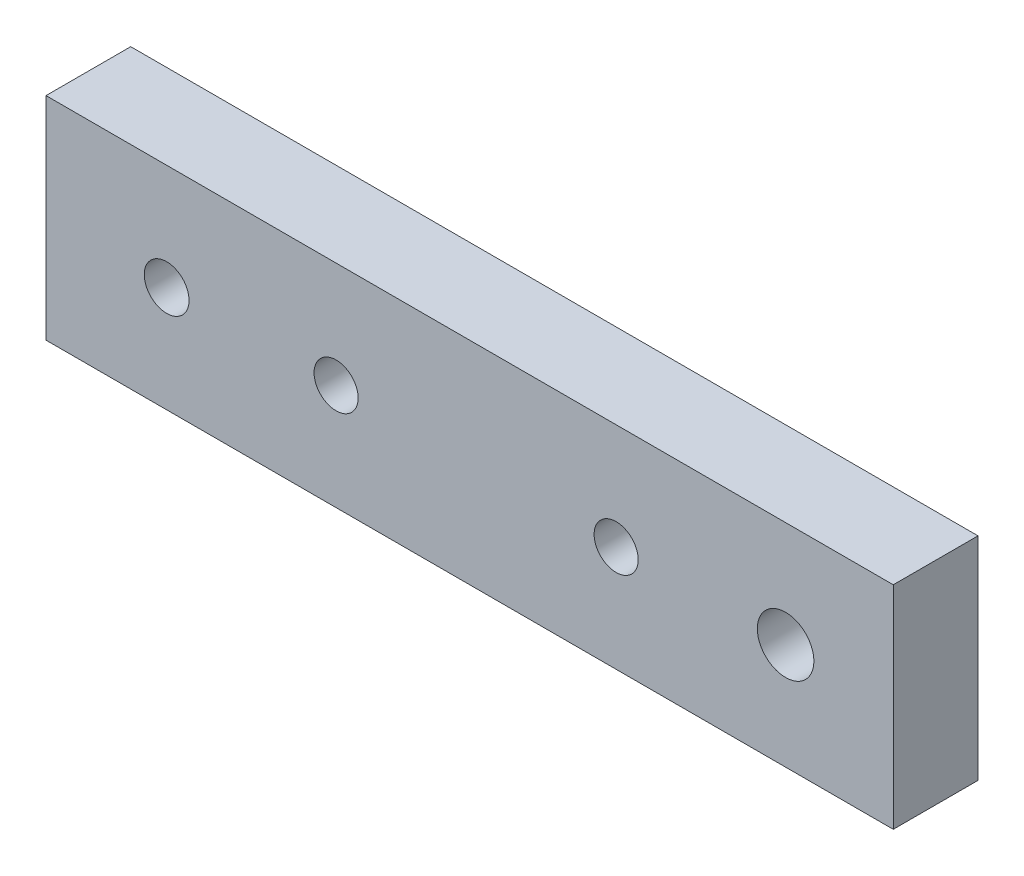
ISO-10303-21;
HEADER;
FILE_DESCRIPTION(('STEP AP214'),'2;1');
FILE_NAME('part.step','',(''),(''),'','','');
FILE_SCHEMA(('AUTOMOTIVE_DESIGN { 1 0 10303 214 1 1 1 1 }'));
ENDSEC;
DATA;
#1=APPLICATION_CONTEXT('core data for automotive mechanical design processes');
#2=APPLICATION_PROTOCOL_DEFINITION('international standard','automotive_design',2000,#1);
#3=PRODUCT_CONTEXT('',#1,'mechanical');
#4=PRODUCT('Part','Part','',(#3));
#5=PRODUCT_RELATED_PRODUCT_CATEGORY('part','',(#4));
#6=PRODUCT_DEFINITION_FORMATION('','',#4);
#7=PRODUCT_DEFINITION_CONTEXT('part definition',#1,'design');
#8=PRODUCT_DEFINITION('design','',#6,#7);
#9=PRODUCT_DEFINITION_SHAPE('','',#8);
#10=(LENGTH_UNIT() NAMED_UNIT(*) SI_UNIT(.MILLI.,.METRE.));
#11=(NAMED_UNIT(*) PLANE_ANGLE_UNIT() SI_UNIT($,.RADIAN.));
#12=(NAMED_UNIT(*) SI_UNIT($,.STERADIAN.) SOLID_ANGLE_UNIT());
#13=UNCERTAINTY_MEASURE_WITH_UNIT(LENGTH_MEASURE(1.E-05),#10,'distance_accuracy_value','');
#14=(GEOMETRIC_REPRESENTATION_CONTEXT(3) GLOBAL_UNCERTAINTY_ASSIGNED_CONTEXT((#13)) GLOBAL_UNIT_ASSIGNED_CONTEXT((#10,
#11,#12)) REPRESENTATION_CONTEXT('',''));
#15=CARTESIAN_POINT('',(0.,0.,0.));
#16=DIRECTION('',(0.,0.,1.));
#17=DIRECTION('',(1.,0.,0.));
#18=AXIS2_PLACEMENT_3D('',#15,#16,#17);
#19=CARTESIAN_POINT('',(116.291637204089,12.5,-75.));
#20=DIRECTION('',(0.,0.,1.));
#21=DIRECTION('',(1.,0.,0.));
#22=AXIS2_PLACEMENT_3D('',#19,#20,#21);
#23=CYLINDRICAL_SURFACE('',#22,3.33518087500682);
#24=CARTESIAN_POINT('',(116.291637204089,12.5,-17.5000000000001));
#25=DIRECTION('',(0.,0.,-1.));
#26=DIRECTION('',(-1.,0.,0.));
#27=AXIS2_PLACEMENT_3D('',#24,#25,#26);
#28=CIRCLE('',#27,3.33518087500682);
#29=CARTESIAN_POINT('',(112.956456329082,12.5,-17.5000000000001));
#30=VERTEX_POINT('',#29);
#31=EDGE_CURVE('E444',#30,#30,#28,.T.);
#32=ORIENTED_EDGE('',*,*,#31,.F.);
#33=EDGE_LOOP('',(#32));
#34=FACE_BOUND('',#33,.T.);
#35=CARTESIAN_POINT('',(116.291637204089,12.5,-24.5000000000001));
#36=DIRECTION('',(0.,0.,-1.));
#37=DIRECTION('',(0.,1.,0.));
#38=AXIS2_PLACEMENT_3D('',#35,#36,#37);
#39=CIRCLE('',#38,3.33518087500682);
#40=CARTESIAN_POINT('',(116.291637204089,15.8351808750068,-24.5000000000001));
#41=VERTEX_POINT('',#40);
#42=EDGE_CURVE('E36',#41,#41,#39,.F.);
#43=ORIENTED_EDGE('',*,*,#42,.F.);
#44=EDGE_LOOP('',(#43));
#45=FACE_BOUND('',#44,.T.);
#46=ADVANCED_FACE('F32',(#34,#45),#23,.F.);
#47=CARTESIAN_POINT('',(43.2405642550662,12.5,-75.));
#48=DIRECTION('',(0.,0.,1.));
#49=DIRECTION('',(1.,0.,0.));
#50=AXIS2_PLACEMENT_3D('',#47,#48,#49);
#51=CYLINDRICAL_SURFACE('',#50,2.64345653870219);
#52=CARTESIAN_POINT('',(43.2405642550662,12.5,-17.5000000000001));
#53=DIRECTION('',(0.,0.,-1.));
#54=DIRECTION('',(-1.,0.,0.));
#55=AXIS2_PLACEMENT_3D('',#52,#53,#54);
#56=CIRCLE('',#55,2.64345653870219);
#57=CARTESIAN_POINT('',(40.597107716364,12.5,-17.5000000000001));
#58=VERTEX_POINT('',#57);
#59=EDGE_CURVE('E447',#58,#58,#56,.T.);
#60=ORIENTED_EDGE('',*,*,#59,.F.);
#61=EDGE_LOOP('',(#60));
#62=FACE_BOUND('',#61,.T.);
#63=CARTESIAN_POINT('',(43.2405642550662,12.5,-24.5000000000001));
#64=DIRECTION('',(0.,0.,-1.));
#65=DIRECTION('',(-1.,0.,0.));
#66=AXIS2_PLACEMENT_3D('',#63,#64,#65);
#67=CIRCLE('',#66,2.64345653870219);
#68=CARTESIAN_POINT('',(40.597107716364,12.5,-24.5000000000001));
#69=VERTEX_POINT('',#68);
#70=EDGE_CURVE('E459',#69,#69,#67,.F.);
#71=ORIENTED_EDGE('',*,*,#70,.F.);
#72=EDGE_LOOP('',(#71));
#73=FACE_BOUND('',#72,.T.);
#74=ADVANCED_FACE('F469',(#62,#73),#51,.F.);
#75=CARTESIAN_POINT('',(96.2916372040886,12.5,-75.));
#76=DIRECTION('',(0.,0.,1.));
#77=DIRECTION('',(1.,0.,0.));
#78=AXIS2_PLACEMENT_3D('',#75,#76,#77);
#79=CYLINDRICAL_SURFACE('',#78,2.6);
#80=CARTESIAN_POINT('',(96.2916372040886,12.5,-17.5000000000001));
#81=DIRECTION('',(0.,0.,-1.));
#82=DIRECTION('',(-1.,0.,0.));
#83=AXIS2_PLACEMENT_3D('',#80,#81,#82);
#84=CIRCLE('',#83,2.6);
#85=CARTESIAN_POINT('',(93.6916372040886,12.5,-17.5000000000001));
#86=VERTEX_POINT('',#85);
#87=EDGE_CURVE('E450',#86,#86,#84,.T.);
#88=ORIENTED_EDGE('',*,*,#87,.F.);
#89=EDGE_LOOP('',(#88));
#90=FACE_BOUND('',#89,.T.);
#91=CARTESIAN_POINT('',(96.2916372040886,12.5,-24.5000000000001));
#92=DIRECTION('',(0.,0.,-1.));
#93=DIRECTION('',(-1.,0.,0.));
#94=AXIS2_PLACEMENT_3D('',#91,#92,#93);
#95=CIRCLE('',#94,2.6);
#96=CARTESIAN_POINT('',(93.6916372040886,12.5,-24.5000000000001));
#97=VERTEX_POINT('',#96);
#98=EDGE_CURVE('E457',#97,#97,#95,.F.);
#99=ORIENTED_EDGE('',*,*,#98,.F.);
#100=EDGE_LOOP('',(#99));
#101=FACE_BOUND('',#100,.T.);
#102=ADVANCED_FACE('F475',(#90,#101),#79,.F.);
#103=CARTESIAN_POINT('',(63.2405642550662,12.5,-75.));
#104=DIRECTION('',(0.,0.,1.));
#105=DIRECTION('',(1.,0.,0.));
#106=AXIS2_PLACEMENT_3D('',#103,#104,#105);
#107=CYLINDRICAL_SURFACE('',#106,2.6);
#108=CARTESIAN_POINT('',(63.2405642550662,12.5,-17.5000000000001));
#109=DIRECTION('',(0.,0.,-1.));
#110=DIRECTION('',(-1.,0.,0.));
#111=AXIS2_PLACEMENT_3D('',#108,#109,#110);
#112=CIRCLE('',#111,2.6);
#113=CARTESIAN_POINT('',(60.6405642550662,12.5,-17.5000000000001));
#114=VERTEX_POINT('',#113);
#115=EDGE_CURVE('E432',#114,#114,#112,.T.);
#116=ORIENTED_EDGE('',*,*,#115,.F.);
#117=EDGE_LOOP('',(#116));
#118=FACE_BOUND('',#117,.T.);
#119=CARTESIAN_POINT('',(63.2405642550662,12.5,-24.5000000000001));
#120=DIRECTION('',(0.,0.,-1.));
#121=DIRECTION('',(-1.,0.,0.));
#122=AXIS2_PLACEMENT_3D('',#119,#120,#121);
#123=CIRCLE('',#122,2.6);
#124=CARTESIAN_POINT('',(60.6405642550662,12.5,-24.5000000000001));
#125=VERTEX_POINT('',#124);
#126=EDGE_CURVE('E268',#125,#125,#123,.F.);
#127=ORIENTED_EDGE('',*,*,#126,.F.);
#128=EDGE_LOOP('',(#127));
#129=FACE_BOUND('',#128,.T.);
#130=ADVANCED_FACE('F502',(#118,#129),#107,.F.);
#131=CARTESIAN_POINT('',(29.0000000000001,25.,-27.5000000000001));
#132=DIRECTION('',(1.,0.,0.));
#133=DIRECTION('',(0.,0.,-1.));
#134=AXIS2_PLACEMENT_3D('',#131,#132,#133);
#135=PLANE('',#134);
#136=DIRECTION('',(0.,1.,0.));
#137=VECTOR('',#136,1.);
#138=CARTESIAN_POINT('',(29.0000000000001,25.,-17.5000000000001));
#139=LINE('',#138,#137);
#140=CARTESIAN_POINT('',(29.0000000000001,0.,-17.5000000000001));
#141=VERTEX_POINT('',#140);
#142=CARTESIAN_POINT('',(29.0000000000001,25.,-17.5000000000001));
#143=VERTEX_POINT('',#142);
#144=EDGE_CURVE('E428',#141,#143,#139,.T.);
#145=ORIENTED_EDGE('',*,*,#144,.T.);
#146=DIRECTION('',(0.,0.,1.));
#147=VECTOR('',#146,1.);
#148=CARTESIAN_POINT('',(29.0000000000001,25.,-27.5000000000001));
#149=LINE('',#148,#147);
#150=CARTESIAN_POINT('',(29.0000000000001,25.,-27.5000000000001));
#151=VERTEX_POINT('',#150);
#152=EDGE_CURVE('E11',#151,#143,#149,.T.);
#153=ORIENTED_EDGE('',*,*,#152,.F.);
#154=DIRECTION('',(0.,1.,0.));
#155=VECTOR('',#154,1.);
#156=CARTESIAN_POINT('',(29.0000000000001,25.,-27.5000000000001));
#157=LINE('',#156,#155);
#158=CARTESIAN_POINT('',(29.0000000000001,0.,-27.5000000000001));
#159=VERTEX_POINT('',#158);
#160=EDGE_CURVE('E417',#159,#151,#157,.T.);
#161=ORIENTED_EDGE('',*,*,#160,.F.);
#162=DIRECTION('',(0.,0.,1.));
#163=VECTOR('',#162,1.);
#164=CARTESIAN_POINT('',(29.0000000000001,0.,-27.5000000000001));
#165=LINE('',#164,#163);
#166=EDGE_CURVE('E427',#159,#141,#165,.T.);
#167=ORIENTED_EDGE('',*,*,#166,.T.);
#168=EDGE_LOOP('',(#145,#153,#161,#167));
#169=FACE_BOUND('',#168,.T.);
#170=ADVANCED_FACE('F34',(#169),#135,.F.);
#171=CARTESIAN_POINT('',(129.,25.,-27.5000000000001));
#172=DIRECTION('',(0.,-1.,0.));
#173=DIRECTION('',(0.,0.,-1.));
#174=AXIS2_PLACEMENT_3D('',#171,#172,#173);
#175=PLANE('',#174);
#176=DIRECTION('',(1.,0.,0.));
#177=VECTOR('',#176,1.);
#178=CARTESIAN_POINT('',(129.,25.,-17.5000000000001));
#179=LINE('',#178,#177);
#180=CARTESIAN_POINT('',(129.,25.,-17.5000000000001));
#181=VERTEX_POINT('',#180);
#182=EDGE_CURVE('E431',#143,#181,#179,.T.);
#183=ORIENTED_EDGE('',*,*,#182,.T.);
#184=DIRECTION('',(0.,0.,1.));
#185=VECTOR('',#184,1.);
#186=CARTESIAN_POINT('',(129.,25.,-27.5000000000001));
#187=LINE('',#186,#185);
#188=CARTESIAN_POINT('',(129.,25.,-27.5000000000001));
#189=VERTEX_POINT('',#188);
#190=EDGE_CURVE('E41',#189,#181,#187,.T.);
#191=ORIENTED_EDGE('',*,*,#190,.F.);
#192=DIRECTION('',(1.,0.,0.));
#193=VECTOR('',#192,1.);
#194=CARTESIAN_POINT('',(129.,25.,-27.5000000000001));
#195=LINE('',#194,#193);
#196=EDGE_CURVE('E420',#151,#189,#195,.T.);
#197=ORIENTED_EDGE('',*,*,#196,.F.);
#198=ORIENTED_EDGE('',*,*,#152,.T.);
#199=EDGE_LOOP('',(#183,#191,#197,#198));
#200=FACE_BOUND('',#199,.T.);
#201=ADVANCED_FACE('F495',(#200),#175,.F.);
#202=CARTESIAN_POINT('',(129.,25.,-27.5000000000001));
#203=DIRECTION('',(-1.,0.,0.));
#204=DIRECTION('',(0.,-1.,0.));
#205=AXIS2_PLACEMENT_3D('',#202,#203,#204);
#206=PLANE('',#205);
#207=DIRECTION('',(0.,-1.,0.));
#208=VECTOR('',#207,1.);
#209=CARTESIAN_POINT('',(129.,25.,-17.5000000000001));
#210=LINE('',#209,#208);
#211=CARTESIAN_POINT('',(129.,0.,-17.5000000000001));
#212=VERTEX_POINT('',#211);
#213=EDGE_CURVE('E434',#181,#212,#210,.T.);
#214=ORIENTED_EDGE('',*,*,#213,.T.);
#215=DIRECTION('',(0.,0.,1.));
#216=VECTOR('',#215,1.);
#217=CARTESIAN_POINT('',(129.,0.,-27.5000000000001));
#218=LINE('',#217,#216);
#219=CARTESIAN_POINT('',(129.,0.,-27.5000000000001));
#220=VERTEX_POINT('',#219);
#221=EDGE_CURVE('E439',#220,#212,#218,.T.);
#222=ORIENTED_EDGE('',*,*,#221,.F.);
#223=DIRECTION('',(0.,-1.,0.));
#224=VECTOR('',#223,1.);
#225=CARTESIAN_POINT('',(129.,25.,-27.5000000000001));
#226=LINE('',#225,#224);
#227=EDGE_CURVE('E423',#189,#220,#226,.T.);
#228=ORIENTED_EDGE('',*,*,#227,.F.);
#229=ORIENTED_EDGE('',*,*,#190,.T.);
#230=EDGE_LOOP('',(#214,#222,#228,#229));
#231=FACE_BOUND('',#230,.T.);
#232=ADVANCED_FACE('F492',(#231),#206,.F.);
#233=CARTESIAN_POINT('',(129.,0.,-27.5000000000001));
#234=DIRECTION('',(0.,1.,0.));
#235=DIRECTION('',(-1.,0.,0.));
#236=AXIS2_PLACEMENT_3D('',#233,#234,#235);
#237=PLANE('',#236);
#238=DIRECTION('',(-1.,0.,0.));
#239=VECTOR('',#238,1.);
#240=CARTESIAN_POINT('',(129.,0.,-17.5000000000001));
#241=LINE('',#240,#239);
#242=EDGE_CURVE('E421',#212,#141,#241,.T.);
#243=ORIENTED_EDGE('',*,*,#242,.T.);
#244=ORIENTED_EDGE('',*,*,#166,.F.);
#245=DIRECTION('',(-1.,0.,0.));
#246=VECTOR('',#245,1.);
#247=CARTESIAN_POINT('',(129.,0.,-27.5000000000001));
#248=LINE('',#247,#246);
#249=EDGE_CURVE('E425',#220,#159,#248,.T.);
#250=ORIENTED_EDGE('',*,*,#249,.F.);
#251=ORIENTED_EDGE('',*,*,#221,.T.);
#252=EDGE_LOOP('',(#243,#244,#250,#251));
#253=FACE_BOUND('',#252,.T.);
#254=ADVANCED_FACE('F485',(#253),#237,.F.);
#255=CARTESIAN_POINT('',(0.,0.,-27.5000000000001));
#256=DIRECTION('',(0.,0.,-1.));
#257=DIRECTION('',(-1.,0.,0.));
#258=AXIS2_PLACEMENT_3D('',#255,#256,#257);
#259=PLANE('',#258);
#260=DIRECTION('',(-1.,0.,0.));
#261=VECTOR('',#260,1.);
#262=CARTESIAN_POINT('',(65.6077003587437,8.40000000000001,-27.5000000000001));
#263=LINE('',#262,#261);
#264=CARTESIAN_POINT('',(65.6077003587437,8.40000000000001,-27.5000000000001));
#265=VERTEX_POINT('',#264);
#266=CARTESIAN_POINT('',(60.8734281513888,8.40000000000001,-27.5000000000001));
#267=VERTEX_POINT('',#266);
#268=EDGE_CURVE('E49',#265,#267,#263,.T.);
#269=ORIENTED_EDGE('',*,*,#268,.F.);
#270=DIRECTION('',(-0.499999999999999,-0.866025403784439,0.));
#271=VECTOR('',#270,1.);
#272=CARTESIAN_POINT('',(67.9748364624211,12.5,-27.5000000000001));
#273=LINE('',#272,#271);
#274=CARTESIAN_POINT('',(67.9748364624211,12.5,-27.5000000000001));
#275=VERTEX_POINT('',#274);
#276=EDGE_CURVE('E241',#275,#265,#273,.T.);
#277=ORIENTED_EDGE('',*,*,#276,.F.);
#278=DIRECTION('',(0.5,-0.866025403784439,0.));
#279=VECTOR('',#278,1.);
#280=CARTESIAN_POINT('',(65.6077003587437,16.6,-27.5000000000001));
#281=LINE('',#280,#279);
#282=CARTESIAN_POINT('',(65.6077003587437,16.6,-27.5000000000001));
#283=VERTEX_POINT('',#282);
#284=EDGE_CURVE('E244',#283,#275,#281,.T.);
#285=ORIENTED_EDGE('',*,*,#284,.F.);
#286=DIRECTION('',(1.,0.,0.));
#287=VECTOR('',#286,1.);
#288=CARTESIAN_POINT('',(60.8734281513888,16.6,-27.5000000000001));
#289=LINE('',#288,#287);
#290=CARTESIAN_POINT('',(60.8734281513888,16.6,-27.5000000000001));
#291=VERTEX_POINT('',#290);
#292=EDGE_CURVE('E261',#291,#283,#289,.T.);
#293=ORIENTED_EDGE('',*,*,#292,.F.);
#294=DIRECTION('',(0.5,0.866025403784438,0.));
#295=VECTOR('',#294,1.);
#296=CARTESIAN_POINT('',(58.5062920477113,12.5,-27.5000000000001));
#297=LINE('',#296,#295);
#298=CARTESIAN_POINT('',(58.5062920477113,12.5,-27.5000000000001));
#299=VERTEX_POINT('',#298);
#300=EDGE_CURVE('E258',#299,#291,#297,.T.);
#301=ORIENTED_EDGE('',*,*,#300,.F.);
#302=DIRECTION('',(-0.5,0.866025403784439,0.));
#303=VECTOR('',#302,1.);
#304=CARTESIAN_POINT('',(60.8734281513888,8.40000000000001,-27.5000000000001));
#305=LINE('',#304,#303);
#306=EDGE_CURVE('E255',#267,#299,#305,.T.);
#307=ORIENTED_EDGE('',*,*,#306,.F.);
#308=EDGE_LOOP('',(#269,#277,#285,#293,#301,#307));
#309=FACE_BOUND('',#308,.T.);
#310=DIRECTION('',(-1.,0.,0.));
#311=VECTOR('',#310,1.);
#312=CARTESIAN_POINT('',(98.658773307766,8.40000000000001,-27.5000000000001));
#313=LINE('',#312,#311);
#314=CARTESIAN_POINT('',(98.658773307766,8.40000000000001,-27.5000000000001));
#315=VERTEX_POINT('',#314);
#316=CARTESIAN_POINT('',(93.9245011004111,8.40000000000002,-27.5000000000001));
#317=VERTEX_POINT('',#316);
#318=EDGE_CURVE('E57',#315,#317,#313,.T.);
#319=ORIENTED_EDGE('',*,*,#318,.F.);
#320=DIRECTION('',(-0.5,-0.866025403784438,0.));
#321=VECTOR('',#320,1.);
#322=CARTESIAN_POINT('',(101.025909411443,12.5,-27.5000000000001));
#323=LINE('',#322,#321);
#324=CARTESIAN_POINT('',(101.025909411443,12.5,-27.5000000000001));
#325=VERTEX_POINT('',#324);
#326=EDGE_CURVE('E280',#325,#315,#323,.T.);
#327=ORIENTED_EDGE('',*,*,#326,.F.);
#328=DIRECTION('',(0.500000000000001,-0.866025403784438,0.));
#329=VECTOR('',#328,1.);
#330=CARTESIAN_POINT('',(98.658773307766,16.6,-27.5000000000001));
#331=LINE('',#330,#329);
#332=CARTESIAN_POINT('',(98.658773307766,16.6,-27.5000000000001));
#333=VERTEX_POINT('',#332);
#334=EDGE_CURVE('E307',#333,#325,#331,.T.);
#335=ORIENTED_EDGE('',*,*,#334,.F.);
#336=DIRECTION('',(1.,0.,0.));
#337=VECTOR('',#336,1.);
#338=CARTESIAN_POINT('',(93.9245011004111,16.6,-27.5000000000001));
#339=LINE('',#338,#337);
#340=CARTESIAN_POINT('',(93.9245011004111,16.6,-27.5000000000001));
#341=VERTEX_POINT('',#340);
#342=EDGE_CURVE('E304',#341,#333,#339,.T.);
#343=ORIENTED_EDGE('',*,*,#342,.F.);
#344=DIRECTION('',(0.5,0.866025403784439,0.));
#345=VECTOR('',#344,1.);
#346=CARTESIAN_POINT('',(91.5573649967337,12.5,-27.5000000000001));
#347=LINE('',#346,#345);
#348=CARTESIAN_POINT('',(91.5573649967337,12.5,-27.5000000000001));
#349=VERTEX_POINT('',#348);
#350=EDGE_CURVE('E301',#349,#341,#347,.T.);
#351=ORIENTED_EDGE('',*,*,#350,.F.);
#352=DIRECTION('',(-0.499999999999999,0.866025403784439,0.));
#353=VECTOR('',#352,1.);
#354=CARTESIAN_POINT('',(93.9245011004111,8.40000000000002,-27.5000000000001));
#355=LINE('',#354,#353);
#356=EDGE_CURVE('E297',#317,#349,#355,.T.);
#357=ORIENTED_EDGE('',*,*,#356,.F.);
#358=EDGE_LOOP('',(#319,#327,#335,#343,#351,#357));
#359=FACE_BOUND('',#358,.T.);
#360=DIRECTION('',(-1.,0.,0.));
#361=VECTOR('',#360,1.);
#362=CARTESIAN_POINT('',(45.6077003587437,8.39999999999999,-27.5000000000001));
#363=LINE('',#362,#361);
#364=CARTESIAN_POINT('',(45.6077003587437,8.39999999999999,-27.5000000000001));
#365=VERTEX_POINT('',#364);
#366=CARTESIAN_POINT('',(40.8734281513887,8.39999999999998,-27.5000000000001));
#367=VERTEX_POINT('',#366);
#368=EDGE_CURVE('E342',#365,#367,#363,.T.);
#369=ORIENTED_EDGE('',*,*,#368,.F.);
#370=DIRECTION('',(-0.500000000000001,-0.866025403784438,0.));
#371=VECTOR('',#370,1.);
#372=CARTESIAN_POINT('',(47.9748364624212,12.5,-27.5000000000001));
#373=LINE('',#372,#371);
#374=CARTESIAN_POINT('',(47.9748364624212,12.5,-27.5000000000001));
#375=VERTEX_POINT('',#374);
#376=EDGE_CURVE('E326',#375,#365,#373,.T.);
#377=ORIENTED_EDGE('',*,*,#376,.F.);
#378=DIRECTION('',(0.5,-0.866025403784439,0.));
#379=VECTOR('',#378,1.);
#380=CARTESIAN_POINT('',(45.6077003587437,16.6,-27.5000000000001));
#381=LINE('',#380,#379);
#382=CARTESIAN_POINT('',(45.6077003587437,16.6,-27.5000000000001));
#383=VERTEX_POINT('',#382);
#384=EDGE_CURVE('E354',#383,#375,#381,.T.);
#385=ORIENTED_EDGE('',*,*,#384,.F.);
#386=DIRECTION('',(1.,0.,0.));
#387=VECTOR('',#386,1.);
#388=CARTESIAN_POINT('',(40.8734281513888,16.6,-27.5000000000001));
#389=LINE('',#388,#387);
#390=CARTESIAN_POINT('',(40.8734281513888,16.6,-27.5000000000001));
#391=VERTEX_POINT('',#390);
#392=EDGE_CURVE('E351',#391,#383,#389,.T.);
#393=ORIENTED_EDGE('',*,*,#392,.F.);
#394=DIRECTION('',(0.500000000000001,0.866025403784438,0.));
#395=VECTOR('',#394,1.);
#396=CARTESIAN_POINT('',(38.5062920477113,12.5,-27.5000000000001));
#397=LINE('',#396,#395);
#398=CARTESIAN_POINT('',(38.5062920477113,12.5,-27.5000000000001));
#399=VERTEX_POINT('',#398);
#400=EDGE_CURVE('E348',#399,#391,#397,.T.);
#401=ORIENTED_EDGE('',*,*,#400,.F.);
#402=DIRECTION('',(-0.499999999999997,0.86602540378444,0.));
#403=VECTOR('',#402,1.);
#404=CARTESIAN_POINT('',(40.8734281513887,8.39999999999998,-27.5000000000001));
#405=LINE('',#404,#403);
#406=EDGE_CURVE('E344',#367,#399,#405,.T.);
#407=ORIENTED_EDGE('',*,*,#406,.F.);
#408=EDGE_LOOP('',(#369,#377,#385,#393,#401,#407));
#409=FACE_BOUND('',#408,.T.);
#410=DIRECTION('',(-1.,0.,0.));
#411=VECTOR('',#410,1.);
#412=CARTESIAN_POINT('',(118.658773307766,8.39999999999999,-27.5000000000001));
#413=LINE('',#412,#411);
#414=CARTESIAN_POINT('',(118.658773307766,8.39999999999999,-27.5000000000001));
#415=VERTEX_POINT('',#414);
#416=CARTESIAN_POINT('',(113.924501100411,8.39999999999999,-27.5000000000001));
#417=VERTEX_POINT('',#416);
#418=EDGE_CURVE('E390',#415,#417,#413,.T.);
#419=ORIENTED_EDGE('',*,*,#418,.F.);
#420=DIRECTION('',(-0.500000000000006,-0.866025403784435,0.));
#421=VECTOR('',#420,1.);
#422=CARTESIAN_POINT('',(121.025909411444,12.5,-27.5000000000001));
#423=LINE('',#422,#421);
#424=CARTESIAN_POINT('',(121.025909411444,12.5,-27.5000000000001));
#425=VERTEX_POINT('',#424);
#426=EDGE_CURVE('E374',#425,#415,#423,.T.);
#427=ORIENTED_EDGE('',*,*,#426,.F.);
#428=DIRECTION('',(0.5,-0.866025403784439,0.));
#429=VECTOR('',#428,1.);
#430=CARTESIAN_POINT('',(118.658773307766,16.6,-27.5000000000001));
#431=LINE('',#430,#429);
#432=CARTESIAN_POINT('',(118.658773307766,16.6,-27.5000000000001));
#433=VERTEX_POINT('',#432);
#434=EDGE_CURVE('E401',#433,#425,#431,.T.);
#435=ORIENTED_EDGE('',*,*,#434,.F.);
#436=DIRECTION('',(1.,0.,0.));
#437=VECTOR('',#436,1.);
#438=CARTESIAN_POINT('',(113.924501100411,16.6,-27.5000000000001));
#439=LINE('',#438,#437);
#440=CARTESIAN_POINT('',(113.924501100411,16.6,-27.5000000000001));
#441=VERTEX_POINT('',#440);
#442=EDGE_CURVE('E398',#441,#433,#439,.T.);
#443=ORIENTED_EDGE('',*,*,#442,.F.);
#444=DIRECTION('',(0.500000000000005,0.866025403784436,0.));
#445=VECTOR('',#444,1.);
#446=CARTESIAN_POINT('',(111.557364996734,12.5,-27.5000000000001));
#447=LINE('',#446,#445);
#448=CARTESIAN_POINT('',(111.557364996734,12.5,-27.5000000000001));
#449=VERTEX_POINT('',#448);
#450=EDGE_CURVE('E395',#449,#441,#447,.T.);
#451=ORIENTED_EDGE('',*,*,#450,.F.);
#452=DIRECTION('',(-0.500000000000003,0.866025403784437,0.));
#453=VECTOR('',#452,1.);
#454=CARTESIAN_POINT('',(113.924501100411,8.39999999999999,-27.5000000000001));
#455=LINE('',#454,#453);
#456=EDGE_CURVE('E392',#417,#449,#455,.T.);
#457=ORIENTED_EDGE('',*,*,#456,.F.);
#458=EDGE_LOOP('',(#419,#427,#435,#443,#451,#457));
#459=FACE_BOUND('',#458,.T.);
#460=ORIENTED_EDGE('',*,*,#160,.T.);
#461=ORIENTED_EDGE('',*,*,#196,.T.);
#462=ORIENTED_EDGE('',*,*,#227,.T.);
#463=ORIENTED_EDGE('',*,*,#249,.T.);
#464=EDGE_LOOP('',(#460,#461,#462,#463));
#465=FACE_BOUND('',#464,.T.);
#466=ADVANCED_FACE('F481',(#309,#359,#409,#459,#465),#259,.T.);
#467=CARTESIAN_POINT('',(0.,0.,-17.5));
#468=DIRECTION('',(0.,0.,-1.));
#469=DIRECTION('',(-1.,0.,0.));
#470=AXIS2_PLACEMENT_3D('',#467,#468,#469);
#471=PLANE('',#470);
#472=ORIENTED_EDGE('',*,*,#115,.T.);
#473=EDGE_LOOP('',(#472));
#474=FACE_BOUND('',#473,.T.);
#475=ORIENTED_EDGE('',*,*,#87,.T.);
#476=EDGE_LOOP('',(#475));
#477=FACE_BOUND('',#476,.T.);
#478=ORIENTED_EDGE('',*,*,#59,.T.);
#479=EDGE_LOOP('',(#478));
#480=FACE_BOUND('',#479,.T.);
#481=ORIENTED_EDGE('',*,*,#31,.T.);
#482=EDGE_LOOP('',(#481));
#483=FACE_BOUND('',#482,.T.);
#484=ORIENTED_EDGE('',*,*,#144,.F.);
#485=ORIENTED_EDGE('',*,*,#242,.F.);
#486=ORIENTED_EDGE('',*,*,#213,.F.);
#487=ORIENTED_EDGE('',*,*,#182,.F.);
#488=EDGE_LOOP('',(#484,#485,#486,#487));
#489=FACE_BOUND('',#488,.T.);
#490=ADVANCED_FACE('F484',(#474,#477,#480,#483,#489),#471,.F.);
#491=CARTESIAN_POINT('',(0.,0.,-24.5));
#492=DIRECTION('',(0.,0.,-1.));
#493=DIRECTION('',(-1.,0.,0.));
#494=AXIS2_PLACEMENT_3D('',#491,#492,#493);
#495=PLANE('',#494);
#496=DIRECTION('',(-1.,0.,0.));
#497=VECTOR('',#496,1.);
#498=CARTESIAN_POINT('',(65.6077003587437,8.40000000000001,-24.5000000000001));
#499=LINE('',#498,#497);
#500=CARTESIAN_POINT('',(65.6077003587437,8.40000000000001,-24.5000000000001));
#501=VERTEX_POINT('',#500);
#502=CARTESIAN_POINT('',(60.8734281513888,8.40000000000001,-24.5000000000001));
#503=VERTEX_POINT('',#502);
#504=EDGE_CURVE('E221',#501,#503,#499,.T.);
#505=ORIENTED_EDGE('',*,*,#504,.T.);
#506=DIRECTION('',(-0.5,0.866025403784439,0.));
#507=VECTOR('',#506,1.);
#508=CARTESIAN_POINT('',(60.8734281513888,8.40000000000001,-24.5000000000001));
#509=LINE('',#508,#507);
#510=CARTESIAN_POINT('',(58.5062920477113,12.5,-24.5000000000001));
#511=VERTEX_POINT('',#510);
#512=EDGE_CURVE('E230',#503,#511,#509,.T.);
#513=ORIENTED_EDGE('',*,*,#512,.T.);
#514=DIRECTION('',(0.5,0.866025403784438,0.));
#515=VECTOR('',#514,1.);
#516=CARTESIAN_POINT('',(58.5062920477113,12.5,-24.5000000000001));
#517=LINE('',#516,#515);
#518=CARTESIAN_POINT('',(60.8734281513888,16.6,-24.5000000000001));
#519=VERTEX_POINT('',#518);
#520=EDGE_CURVE('E235',#511,#519,#517,.T.);
#521=ORIENTED_EDGE('',*,*,#520,.T.);
#522=DIRECTION('',(1.,0.,0.));
#523=VECTOR('',#522,1.);
#524=CARTESIAN_POINT('',(60.8734281513888,16.6,-24.5000000000001));
#525=LINE('',#524,#523);
#526=CARTESIAN_POINT('',(65.6077003587437,16.6,-24.5000000000001));
#527=VERTEX_POINT('',#526);
#528=EDGE_CURVE('E248',#519,#527,#525,.T.);
#529=ORIENTED_EDGE('',*,*,#528,.T.);
#530=DIRECTION('',(0.5,-0.866025403784439,0.));
#531=VECTOR('',#530,1.);
#532=CARTESIAN_POINT('',(65.6077003587437,16.6,-24.5000000000001));
#533=LINE('',#532,#531);
#534=CARTESIAN_POINT('',(67.9748364624211,12.5,-24.5000000000001));
#535=VERTEX_POINT('',#534);
#536=EDGE_CURVE('E251',#527,#535,#533,.T.);
#537=ORIENTED_EDGE('',*,*,#536,.T.);
#538=DIRECTION('',(-0.499999999999999,-0.866025403784439,0.));
#539=VECTOR('',#538,1.);
#540=CARTESIAN_POINT('',(67.9748364624211,12.5,-24.5000000000001));
#541=LINE('',#540,#539);
#542=EDGE_CURVE('E227',#535,#501,#541,.T.);
#543=ORIENTED_EDGE('',*,*,#542,.T.);
#544=EDGE_LOOP('',(#505,#513,#521,#529,#537,#543));
#545=FACE_BOUND('',#544,.T.);
#546=ORIENTED_EDGE('',*,*,#126,.T.);
#547=EDGE_LOOP('',(#546));
#548=FACE_BOUND('',#547,.T.);
#549=ADVANCED_FACE('F237',(#545,#548),#495,.T.);
#550=CARTESIAN_POINT('',(65.6077003587437,8.40000000000001,-24.5000000000001));
#551=DIRECTION('',(0.,-1.,0.));
#552=DIRECTION('',(1.,0.,0.));
#553=AXIS2_PLACEMENT_3D('',#550,#551,#552);
#554=PLANE('',#553);
#555=ORIENTED_EDGE('',*,*,#268,.T.);
#556=DIRECTION('',(0.,0.,-1.));
#557=VECTOR('',#556,1.);
#558=CARTESIAN_POINT('',(60.8734281513888,8.40000000000001,-24.5000000000001));
#559=LINE('',#558,#557);
#560=EDGE_CURVE('E217',#503,#267,#559,.T.);
#561=ORIENTED_EDGE('',*,*,#560,.F.);
#562=ORIENTED_EDGE('',*,*,#504,.F.);
#563=DIRECTION('',(0.,0.,-1.));
#564=VECTOR('',#563,1.);
#565=CARTESIAN_POINT('',(65.6077003587437,8.40000000000001,-24.5000000000001));
#566=LINE('',#565,#564);
#567=EDGE_CURVE('E266',#501,#265,#566,.T.);
#568=ORIENTED_EDGE('',*,*,#567,.T.);
#569=EDGE_LOOP('',(#555,#561,#562,#568));
#570=FACE_BOUND('',#569,.T.);
#571=ADVANCED_FACE('F219',(#570),#554,.F.);
#572=CARTESIAN_POINT('',(67.9748364624211,12.5,-24.5000000000001));
#573=DIRECTION('',(0.866025403784439,-0.499999999999999,0.));
#574=DIRECTION('',(0.499999999999999,0.866025403784439,0.));
#575=AXIS2_PLACEMENT_3D('',#572,#573,#574);
#576=PLANE('',#575);
#577=ORIENTED_EDGE('',*,*,#276,.T.);
#578=ORIENTED_EDGE('',*,*,#567,.F.);
#579=ORIENTED_EDGE('',*,*,#542,.F.);
#580=DIRECTION('',(0.,0.,-1.));
#581=VECTOR('',#580,1.);
#582=CARTESIAN_POINT('',(67.9748364624211,12.5,-24.5000000000001));
#583=LINE('',#582,#581);
#584=EDGE_CURVE('E269',#535,#275,#583,.T.);
#585=ORIENTED_EDGE('',*,*,#584,.T.);
#586=EDGE_LOOP('',(#577,#578,#579,#585));
#587=FACE_BOUND('',#586,.T.);
#588=ADVANCED_FACE('F612',(#587),#576,.F.);
#589=CARTESIAN_POINT('',(65.6077003587437,16.6,-24.5000000000001));
#590=DIRECTION('',(0.866025403784439,0.5,0.));
#591=DIRECTION('',(-0.5,0.866025403784439,0.));
#592=AXIS2_PLACEMENT_3D('',#589,#590,#591);
#593=PLANE('',#592);
#594=ORIENTED_EDGE('',*,*,#284,.T.);
#595=ORIENTED_EDGE('',*,*,#584,.F.);
#596=ORIENTED_EDGE('',*,*,#536,.F.);
#597=DIRECTION('',(0.,0.,-1.));
#598=VECTOR('',#597,1.);
#599=CARTESIAN_POINT('',(65.6077003587437,16.6,-24.5000000000001));
#600=LINE('',#599,#598);
#601=EDGE_CURVE('E271',#527,#283,#600,.T.);
#602=ORIENTED_EDGE('',*,*,#601,.T.);
#603=EDGE_LOOP('',(#594,#595,#596,#602));
#604=FACE_BOUND('',#603,.T.);
#605=ADVANCED_FACE('F622',(#604),#593,.F.);
#606=CARTESIAN_POINT('',(60.8734281513888,16.6,-24.5000000000001));
#607=DIRECTION('',(0.,1.,0.));
#608=DIRECTION('',(0.,0.,1.));
#609=AXIS2_PLACEMENT_3D('',#606,#607,#608);
#610=PLANE('',#609);
#611=ORIENTED_EDGE('',*,*,#292,.T.);
#612=ORIENTED_EDGE('',*,*,#601,.F.);
#613=ORIENTED_EDGE('',*,*,#528,.F.);
#614=DIRECTION('',(0.,0.,-1.));
#615=VECTOR('',#614,1.);
#616=CARTESIAN_POINT('',(60.8734281513888,16.6,-24.5000000000001));
#617=LINE('',#616,#615);
#618=EDGE_CURVE('E273',#519,#291,#617,.T.);
#619=ORIENTED_EDGE('',*,*,#618,.T.);
#620=EDGE_LOOP('',(#611,#612,#613,#619));
#621=FACE_BOUND('',#620,.T.);
#622=ADVANCED_FACE('F618',(#621),#610,.F.);
#623=CARTESIAN_POINT('',(58.5062920477113,12.5,-24.5000000000001));
#624=DIRECTION('',(-0.866025403784438,0.500000000000001,0.));
#625=DIRECTION('',(-0.500000000000001,-0.866025403784438,0.));
#626=AXIS2_PLACEMENT_3D('',#623,#624,#625);
#627=PLANE('',#626);
#628=ORIENTED_EDGE('',*,*,#300,.T.);
#629=ORIENTED_EDGE('',*,*,#618,.F.);
#630=ORIENTED_EDGE('',*,*,#520,.F.);
#631=DIRECTION('',(0.,0.,-1.));
#632=VECTOR('',#631,1.);
#633=CARTESIAN_POINT('',(58.5062920477113,12.5,-24.5000000000001));
#634=LINE('',#633,#632);
#635=EDGE_CURVE('E226',#511,#299,#634,.T.);
#636=ORIENTED_EDGE('',*,*,#635,.T.);
#637=EDGE_LOOP('',(#628,#629,#630,#636));
#638=FACE_BOUND('',#637,.T.);
#639=ADVANCED_FACE('F615',(#638),#627,.F.);
#640=CARTESIAN_POINT('',(60.8734281513888,8.40000000000001,-24.5000000000001));
#641=DIRECTION('',(-0.866025403784438,-0.5,0.));
#642=DIRECTION('',(0.5,-0.866025403784439,0.));
#643=AXIS2_PLACEMENT_3D('',#640,#641,#642);
#644=PLANE('',#643);
#645=ORIENTED_EDGE('',*,*,#306,.T.);
#646=ORIENTED_EDGE('',*,*,#635,.F.);
#647=ORIENTED_EDGE('',*,*,#512,.F.);
#648=ORIENTED_EDGE('',*,*,#560,.T.);
#649=EDGE_LOOP('',(#645,#646,#647,#648));
#650=FACE_BOUND('',#649,.T.);
#651=ADVANCED_FACE('F231',(#650),#644,.F.);
#652=CARTESIAN_POINT('',(0.,0.,-24.5));
#653=DIRECTION('',(0.,0.,-1.));
#654=DIRECTION('',(-1.,0.,0.));
#655=AXIS2_PLACEMENT_3D('',#652,#653,#654);
#656=PLANE('',#655);
#657=DIRECTION('',(-1.,0.,0.));
#658=VECTOR('',#657,1.);
#659=CARTESIAN_POINT('',(98.658773307766,8.40000000000001,-24.5000000000001));
#660=LINE('',#659,#658);
#661=CARTESIAN_POINT('',(98.658773307766,8.40000000000001,-24.5000000000001));
#662=VERTEX_POINT('',#661);
#663=CARTESIAN_POINT('',(93.9245011004111,8.40000000000002,-24.5000000000001));
#664=VERTEX_POINT('',#663);
#665=EDGE_CURVE('E276',#662,#664,#660,.T.);
#666=ORIENTED_EDGE('',*,*,#665,.T.);
#667=DIRECTION('',(-0.499999999999999,0.866025403784439,0.));
#668=VECTOR('',#667,1.);
#669=CARTESIAN_POINT('',(93.9245011004111,8.40000000000002,-24.5000000000001));
#670=LINE('',#669,#668);
#671=CARTESIAN_POINT('',(91.5573649967337,12.5,-24.5000000000001));
#672=VERTEX_POINT('',#671);
#673=EDGE_CURVE('E279',#664,#672,#670,.T.);
#674=ORIENTED_EDGE('',*,*,#673,.T.);
#675=DIRECTION('',(0.5,0.866025403784439,0.));
#676=VECTOR('',#675,1.);
#677=CARTESIAN_POINT('',(91.5573649967337,12.5,-24.5000000000001));
#678=LINE('',#677,#676);
#679=CARTESIAN_POINT('',(93.9245011004111,16.6,-24.5000000000001));
#680=VERTEX_POINT('',#679);
#681=EDGE_CURVE('E283',#672,#680,#678,.T.);
#682=ORIENTED_EDGE('',*,*,#681,.T.);
#683=DIRECTION('',(1.,0.,0.));
#684=VECTOR('',#683,1.);
#685=CARTESIAN_POINT('',(93.9245011004111,16.6,-24.5000000000001));
#686=LINE('',#685,#684);
#687=CARTESIAN_POINT('',(98.658773307766,16.6,-24.5000000000001));
#688=VERTEX_POINT('',#687);
#689=EDGE_CURVE('E286',#680,#688,#686,.T.);
#690=ORIENTED_EDGE('',*,*,#689,.T.);
#691=DIRECTION('',(0.500000000000001,-0.866025403784438,0.));
#692=VECTOR('',#691,1.);
#693=CARTESIAN_POINT('',(98.658773307766,16.6,-24.5000000000001));
#694=LINE('',#693,#692);
#695=CARTESIAN_POINT('',(101.025909411443,12.5,-24.5000000000001));
#696=VERTEX_POINT('',#695);
#697=EDGE_CURVE('E289',#688,#696,#694,.T.);
#698=ORIENTED_EDGE('',*,*,#697,.T.);
#699=DIRECTION('',(-0.5,-0.866025403784438,0.));
#700=VECTOR('',#699,1.);
#701=CARTESIAN_POINT('',(101.025909411443,12.5,-24.5000000000001));
#702=LINE('',#701,#700);
#703=EDGE_CURVE('E292',#696,#662,#702,.T.);
#704=ORIENTED_EDGE('',*,*,#703,.T.);
#705=EDGE_LOOP('',(#666,#674,#682,#690,#698,#704));
#706=FACE_BOUND('',#705,.T.);
#707=ORIENTED_EDGE('',*,*,#98,.T.);
#708=EDGE_LOOP('',(#707));
#709=FACE_BOUND('',#708,.T.);
#710=ADVANCED_FACE('F588',(#706,#709),#656,.T.);
#711=CARTESIAN_POINT('',(98.658773307766,8.40000000000001,-24.5000000000001));
#712=DIRECTION('',(0.,-1.,0.));
#713=DIRECTION('',(1.,0.,0.));
#714=AXIS2_PLACEMENT_3D('',#711,#712,#713);
#715=PLANE('',#714);
#716=ORIENTED_EDGE('',*,*,#318,.T.);
#717=DIRECTION('',(0.,0.,-1.));
#718=VECTOR('',#717,1.);
#719=CARTESIAN_POINT('',(93.9245011004111,8.40000000000002,-24.5000000000001));
#720=LINE('',#719,#718);
#721=EDGE_CURVE('E295',#664,#317,#720,.T.);
#722=ORIENTED_EDGE('',*,*,#721,.F.);
#723=ORIENTED_EDGE('',*,*,#665,.F.);
#724=DIRECTION('',(0.,0.,-1.));
#725=VECTOR('',#724,1.);
#726=CARTESIAN_POINT('',(98.658773307766,8.40000000000001,-24.5000000000001));
#727=LINE('',#726,#725);
#728=EDGE_CURVE('E256',#662,#315,#727,.T.);
#729=ORIENTED_EDGE('',*,*,#728,.T.);
#730=EDGE_LOOP('',(#716,#722,#723,#729));
#731=FACE_BOUND('',#730,.T.);
#732=ADVANCED_FACE('F584',(#731),#715,.F.);
#733=CARTESIAN_POINT('',(101.025909411443,12.5,-24.5000000000001));
#734=DIRECTION('',(0.866025403784438,-0.5,0.));
#735=DIRECTION('',(0.5,0.866025403784438,0.));
#736=AXIS2_PLACEMENT_3D('',#733,#734,#735);
#737=PLANE('',#736);
#738=ORIENTED_EDGE('',*,*,#326,.T.);
#739=ORIENTED_EDGE('',*,*,#728,.F.);
#740=ORIENTED_EDGE('',*,*,#703,.F.);
#741=DIRECTION('',(0.,0.,-1.));
#742=VECTOR('',#741,1.);
#743=CARTESIAN_POINT('',(101.025909411443,12.5,-24.5000000000001));
#744=LINE('',#743,#742);
#745=EDGE_CURVE('E313',#696,#325,#744,.T.);
#746=ORIENTED_EDGE('',*,*,#745,.T.);
#747=EDGE_LOOP('',(#738,#739,#740,#746));
#748=FACE_BOUND('',#747,.T.);
#749=ADVANCED_FACE('F587',(#748),#737,.F.);
#750=CARTESIAN_POINT('',(98.658773307766,16.6,-24.5000000000001));
#751=DIRECTION('',(0.866025403784438,0.500000000000001,0.));
#752=DIRECTION('',(-0.500000000000001,0.866025403784438,0.));
#753=AXIS2_PLACEMENT_3D('',#750,#751,#752);
#754=PLANE('',#753);
#755=ORIENTED_EDGE('',*,*,#334,.T.);
#756=ORIENTED_EDGE('',*,*,#745,.F.);
#757=ORIENTED_EDGE('',*,*,#697,.F.);
#758=DIRECTION('',(0.,0.,-1.));
#759=VECTOR('',#758,1.);
#760=CARTESIAN_POINT('',(98.658773307766,16.6,-24.5000000000001));
#761=LINE('',#760,#759);
#762=EDGE_CURVE('E315',#688,#333,#761,.T.);
#763=ORIENTED_EDGE('',*,*,#762,.T.);
#764=EDGE_LOOP('',(#755,#756,#757,#763));
#765=FACE_BOUND('',#764,.T.);
#766=ADVANCED_FACE('F599',(#765),#754,.F.);
#767=CARTESIAN_POINT('',(93.9245011004111,16.6,-24.5000000000001));
#768=DIRECTION('',(0.,1.,0.));
#769=DIRECTION('',(0.,0.,1.));
#770=AXIS2_PLACEMENT_3D('',#767,#768,#769);
#771=PLANE('',#770);
#772=ORIENTED_EDGE('',*,*,#342,.T.);
#773=ORIENTED_EDGE('',*,*,#762,.F.);
#774=ORIENTED_EDGE('',*,*,#689,.F.);
#775=DIRECTION('',(0.,0.,-1.));
#776=VECTOR('',#775,1.);
#777=CARTESIAN_POINT('',(93.9245011004111,16.6,-24.5000000000001));
#778=LINE('',#777,#776);
#779=EDGE_CURVE('E317',#680,#341,#778,.T.);
#780=ORIENTED_EDGE('',*,*,#779,.T.);
#781=EDGE_LOOP('',(#772,#773,#774,#780));
#782=FACE_BOUND('',#781,.T.);
#783=ADVANCED_FACE('F595',(#782),#771,.F.);
#784=CARTESIAN_POINT('',(91.5573649967337,12.5,-24.5000000000001));
#785=DIRECTION('',(-0.866025403784439,0.5,0.));
#786=DIRECTION('',(-0.5,-0.866025403784439,0.));
#787=AXIS2_PLACEMENT_3D('',#784,#785,#786);
#788=PLANE('',#787);
#789=ORIENTED_EDGE('',*,*,#350,.T.);
#790=ORIENTED_EDGE('',*,*,#779,.F.);
#791=ORIENTED_EDGE('',*,*,#681,.F.);
#792=DIRECTION('',(0.,0.,-1.));
#793=VECTOR('',#792,1.);
#794=CARTESIAN_POINT('',(91.5573649967337,12.5,-24.5000000000001));
#795=LINE('',#794,#793);
#796=EDGE_CURVE('E319',#672,#349,#795,.T.);
#797=ORIENTED_EDGE('',*,*,#796,.T.);
#798=EDGE_LOOP('',(#789,#790,#791,#797));
#799=FACE_BOUND('',#798,.T.);
#800=ADVANCED_FACE('F591',(#799),#788,.F.);
#801=CARTESIAN_POINT('',(93.9245011004111,8.40000000000002,-24.5000000000001));
#802=DIRECTION('',(-0.866025403784439,-0.499999999999999,0.));
#803=DIRECTION('',(0.499999999999999,-0.866025403784439,0.));
#804=AXIS2_PLACEMENT_3D('',#801,#802,#803);
#805=PLANE('',#804);
#806=ORIENTED_EDGE('',*,*,#356,.T.);
#807=ORIENTED_EDGE('',*,*,#796,.F.);
#808=ORIENTED_EDGE('',*,*,#673,.F.);
#809=ORIENTED_EDGE('',*,*,#721,.T.);
#810=EDGE_LOOP('',(#806,#807,#808,#809));
#811=FACE_BOUND('',#810,.T.);
#812=ADVANCED_FACE('F582',(#811),#805,.F.);
#813=CARTESIAN_POINT('',(0.,0.,-24.5000000000001));
#814=DIRECTION('',(0.,0.,-1.));
#815=DIRECTION('',(-1.,0.,0.));
#816=AXIS2_PLACEMENT_3D('',#813,#814,#815);
#817=PLANE('',#816);
#818=DIRECTION('',(-1.,0.,0.));
#819=VECTOR('',#818,1.);
#820=CARTESIAN_POINT('',(45.6077003587437,8.39999999999999,-24.5000000000001));
#821=LINE('',#820,#819);
#822=CARTESIAN_POINT('',(45.6077003587437,8.39999999999999,-24.5000000000001));
#823=VERTEX_POINT('',#822);
#824=CARTESIAN_POINT('',(40.8734281513887,8.39999999999998,-24.5000000000001));
#825=VERTEX_POINT('',#824);
#826=EDGE_CURVE('E322',#823,#825,#821,.T.);
#827=ORIENTED_EDGE('',*,*,#826,.T.);
#828=DIRECTION('',(-0.499999999999997,0.86602540378444,0.));
#829=VECTOR('',#828,1.);
#830=CARTESIAN_POINT('',(40.8734281513887,8.39999999999998,-24.5000000000001));
#831=LINE('',#830,#829);
#832=CARTESIAN_POINT('',(38.5062920477113,12.5,-24.5000000000001));
#833=VERTEX_POINT('',#832);
#834=EDGE_CURVE('E325',#825,#833,#831,.T.);
#835=ORIENTED_EDGE('',*,*,#834,.T.);
#836=DIRECTION('',(0.500000000000001,0.866025403784438,0.));
#837=VECTOR('',#836,1.);
#838=CARTESIAN_POINT('',(38.5062920477113,12.5,-24.5000000000001));
#839=LINE('',#838,#837);
#840=CARTESIAN_POINT('',(40.8734281513888,16.6,-24.5000000000001));
#841=VERTEX_POINT('',#840);
#842=EDGE_CURVE('E329',#833,#841,#839,.T.);
#843=ORIENTED_EDGE('',*,*,#842,.T.);
#844=DIRECTION('',(1.,0.,0.));
#845=VECTOR('',#844,1.);
#846=CARTESIAN_POINT('',(40.8734281513888,16.6,-24.5000000000001));
#847=LINE('',#846,#845);
#848=CARTESIAN_POINT('',(45.6077003587437,16.6,-24.5000000000001));
#849=VERTEX_POINT('',#848);
#850=EDGE_CURVE('E332',#841,#849,#847,.T.);
#851=ORIENTED_EDGE('',*,*,#850,.T.);
#852=DIRECTION('',(0.5,-0.866025403784439,0.));
#853=VECTOR('',#852,1.);
#854=CARTESIAN_POINT('',(45.6077003587437,16.6,-24.5000000000001));
#855=LINE('',#854,#853);
#856=CARTESIAN_POINT('',(47.9748364624212,12.5,-24.5000000000001));
#857=VERTEX_POINT('',#856);
#858=EDGE_CURVE('E335',#849,#857,#855,.T.);
#859=ORIENTED_EDGE('',*,*,#858,.T.);
#860=DIRECTION('',(-0.500000000000001,-0.866025403784438,0.));
#861=VECTOR('',#860,1.);
#862=CARTESIAN_POINT('',(47.9748364624212,12.5,-24.5000000000001));
#863=LINE('',#862,#861);
#864=EDGE_CURVE('E338',#857,#823,#863,.T.);
#865=ORIENTED_EDGE('',*,*,#864,.T.);
#866=EDGE_LOOP('',(#827,#835,#843,#851,#859,#865));
#867=FACE_BOUND('',#866,.T.);
#868=ORIENTED_EDGE('',*,*,#70,.T.);
#869=EDGE_LOOP('',(#868));
#870=FACE_BOUND('',#869,.T.);
#871=ADVANCED_FACE('F560',(#867,#870),#817,.T.);
#872=CARTESIAN_POINT('',(45.6077003587437,8.39999999999999,-24.5000000000001));
#873=DIRECTION('',(0.,-1.,0.));
#874=DIRECTION('',(1.,0.,0.));
#875=AXIS2_PLACEMENT_3D('',#872,#873,#874);
#876=PLANE('',#875);
#877=ORIENTED_EDGE('',*,*,#368,.T.);
#878=DIRECTION('',(0.,0.,-1.));
#879=VECTOR('',#878,1.);
#880=CARTESIAN_POINT('',(40.8734281513887,8.39999999999998,-24.5000000000001));
#881=LINE('',#880,#879);
#882=EDGE_CURVE('E341',#825,#367,#881,.T.);
#883=ORIENTED_EDGE('',*,*,#882,.F.);
#884=ORIENTED_EDGE('',*,*,#826,.F.);
#885=DIRECTION('',(0.,0.,-1.));
#886=VECTOR('',#885,1.);
#887=CARTESIAN_POINT('',(45.6077003587437,8.39999999999999,-24.5000000000001));
#888=LINE('',#887,#886);
#889=EDGE_CURVE('E298',#823,#365,#888,.T.);
#890=ORIENTED_EDGE('',*,*,#889,.T.);
#891=EDGE_LOOP('',(#877,#883,#884,#890));
#892=FACE_BOUND('',#891,.T.);
#893=ADVANCED_FACE('F556',(#892),#876,.F.);
#894=CARTESIAN_POINT('',(47.9748364624212,12.5,-24.5000000000001));
#895=DIRECTION('',(0.866025403784438,-0.500000000000001,0.));
#896=DIRECTION('',(0.500000000000001,0.866025403784438,0.));
#897=AXIS2_PLACEMENT_3D('',#894,#895,#896);
#898=PLANE('',#897);
#899=ORIENTED_EDGE('',*,*,#376,.T.);
#900=ORIENTED_EDGE('',*,*,#889,.F.);
#901=ORIENTED_EDGE('',*,*,#864,.F.);
#902=DIRECTION('',(0.,0.,-1.));
#903=VECTOR('',#902,1.);
#904=CARTESIAN_POINT('',(47.9748364624212,12.5,-24.5000000000001));
#905=LINE('',#904,#903);
#906=EDGE_CURVE('E360',#857,#375,#905,.T.);
#907=ORIENTED_EDGE('',*,*,#906,.T.);
#908=EDGE_LOOP('',(#899,#900,#901,#907));
#909=FACE_BOUND('',#908,.T.);
#910=ADVANCED_FACE('F559',(#909),#898,.F.);
#911=CARTESIAN_POINT('',(45.6077003587437,16.6,-24.5000000000001));
#912=DIRECTION('',(0.866025403784439,0.5,0.));
#913=DIRECTION('',(-0.5,0.866025403784439,0.));
#914=AXIS2_PLACEMENT_3D('',#911,#912,#913);
#915=PLANE('',#914);
#916=ORIENTED_EDGE('',*,*,#384,.T.);
#917=ORIENTED_EDGE('',*,*,#906,.F.);
#918=ORIENTED_EDGE('',*,*,#858,.F.);
#919=DIRECTION('',(0.,0.,-1.));
#920=VECTOR('',#919,1.);
#921=CARTESIAN_POINT('',(45.6077003587437,16.6,-24.5000000000001));
#922=LINE('',#921,#920);
#923=EDGE_CURVE('E362',#849,#383,#922,.T.);
#924=ORIENTED_EDGE('',*,*,#923,.T.);
#925=EDGE_LOOP('',(#916,#917,#918,#924));
#926=FACE_BOUND('',#925,.T.);
#927=ADVANCED_FACE('F572',(#926),#915,.F.);
#928=CARTESIAN_POINT('',(40.8734281513888,16.6,-24.5000000000001));
#929=DIRECTION('',(0.,1.,0.));
#930=DIRECTION('',(0.,0.,1.));
#931=AXIS2_PLACEMENT_3D('',#928,#929,#930);
#932=PLANE('',#931);
#933=ORIENTED_EDGE('',*,*,#392,.T.);
#934=ORIENTED_EDGE('',*,*,#923,.F.);
#935=ORIENTED_EDGE('',*,*,#850,.F.);
#936=DIRECTION('',(0.,0.,-1.));
#937=VECTOR('',#936,1.);
#938=CARTESIAN_POINT('',(40.8734281513888,16.6,-24.5000000000001));
#939=LINE('',#938,#937);
#940=EDGE_CURVE('E364',#841,#391,#939,.T.);
#941=ORIENTED_EDGE('',*,*,#940,.T.);
#942=EDGE_LOOP('',(#933,#934,#935,#941));
#943=FACE_BOUND('',#942,.T.);
#944=ADVANCED_FACE('F568',(#943),#932,.F.);
#945=CARTESIAN_POINT('',(38.5062920477113,12.5,-24.5000000000001));
#946=DIRECTION('',(-0.866025403784438,0.500000000000001,0.));
#947=DIRECTION('',(-0.500000000000001,-0.866025403784438,0.));
#948=AXIS2_PLACEMENT_3D('',#945,#946,#947);
#949=PLANE('',#948);
#950=ORIENTED_EDGE('',*,*,#400,.T.);
#951=ORIENTED_EDGE('',*,*,#940,.F.);
#952=ORIENTED_EDGE('',*,*,#842,.F.);
#953=DIRECTION('',(0.,0.,-1.));
#954=VECTOR('',#953,1.);
#955=CARTESIAN_POINT('',(38.5062920477113,12.5,-24.5000000000001));
#956=LINE('',#955,#954);
#957=EDGE_CURVE('E366',#833,#399,#956,.T.);
#958=ORIENTED_EDGE('',*,*,#957,.T.);
#959=EDGE_LOOP('',(#950,#951,#952,#958));
#960=FACE_BOUND('',#959,.T.);
#961=ADVANCED_FACE('F564',(#960),#949,.F.);
#962=CARTESIAN_POINT('',(40.8734281513887,8.39999999999998,-24.5000000000001));
#963=DIRECTION('',(-0.86602540378444,-0.499999999999997,0.));
#964=DIRECTION('',(0.499999999999997,-0.86602540378444,0.));
#965=AXIS2_PLACEMENT_3D('',#962,#963,#964);
#966=PLANE('',#965);
#967=ORIENTED_EDGE('',*,*,#406,.T.);
#968=ORIENTED_EDGE('',*,*,#957,.F.);
#969=ORIENTED_EDGE('',*,*,#834,.F.);
#970=ORIENTED_EDGE('',*,*,#882,.T.);
#971=EDGE_LOOP('',(#967,#968,#969,#970));
#972=FACE_BOUND('',#971,.T.);
#973=ADVANCED_FACE('F554',(#972),#966,.F.);
#974=CARTESIAN_POINT('',(0.,0.,-24.5000000000001));
#975=DIRECTION('',(0.,0.,-1.));
#976=DIRECTION('',(0.,1.,0.));
#977=AXIS2_PLACEMENT_3D('',#974,#975,#976);
#978=PLANE('',#977);
#979=DIRECTION('',(-1.,0.,0.));
#980=VECTOR('',#979,1.);
#981=CARTESIAN_POINT('',(118.658773307766,8.39999999999999,-24.5000000000001));
#982=LINE('',#981,#980);
#983=CARTESIAN_POINT('',(118.658773307766,8.39999999999999,-24.5000000000001));
#984=VERTEX_POINT('',#983);
#985=CARTESIAN_POINT('',(113.924501100411,8.39999999999999,-24.5000000000001));
#986=VERTEX_POINT('',#985);
#987=EDGE_CURVE('E370',#984,#986,#982,.T.);
#988=ORIENTED_EDGE('',*,*,#987,.T.);
#989=DIRECTION('',(-0.500000000000003,0.866025403784437,0.));
#990=VECTOR('',#989,1.);
#991=CARTESIAN_POINT('',(113.924501100411,8.39999999999999,-24.5000000000001));
#992=LINE('',#991,#990);
#993=CARTESIAN_POINT('',(111.557364996734,12.5,-24.5000000000001));
#994=VERTEX_POINT('',#993);
#995=EDGE_CURVE('E373',#986,#994,#992,.T.);
#996=ORIENTED_EDGE('',*,*,#995,.T.);
#997=DIRECTION('',(0.500000000000005,0.866025403784436,0.));
#998=VECTOR('',#997,1.);
#999=CARTESIAN_POINT('',(111.557364996734,12.5,-24.5000000000001));
#1000=LINE('',#999,#998);
#1001=CARTESIAN_POINT('',(113.924501100411,16.6,-24.5000000000001));
#1002=VERTEX_POINT('',#1001);
#1003=EDGE_CURVE('E377',#994,#1002,#1000,.T.);
#1004=ORIENTED_EDGE('',*,*,#1003,.T.);
#1005=DIRECTION('',(1.,0.,0.));
#1006=VECTOR('',#1005,1.);
#1007=CARTESIAN_POINT('',(113.924501100411,16.6,-24.5000000000001));
#1008=LINE('',#1007,#1006);
#1009=CARTESIAN_POINT('',(118.658773307766,16.6,-24.5000000000001));
#1010=VERTEX_POINT('',#1009);
#1011=EDGE_CURVE('E380',#1002,#1010,#1008,.T.);
#1012=ORIENTED_EDGE('',*,*,#1011,.T.);
#1013=DIRECTION('',(0.5,-0.866025403784439,0.));
#1014=VECTOR('',#1013,1.);
#1015=CARTESIAN_POINT('',(118.658773307766,16.6,-24.5000000000001));
#1016=LINE('',#1015,#1014);
#1017=CARTESIAN_POINT('',(121.025909411444,12.5,-24.5000000000001));
#1018=VERTEX_POINT('',#1017);
#1019=EDGE_CURVE('E383',#1010,#1018,#1016,.T.);
#1020=ORIENTED_EDGE('',*,*,#1019,.T.);
#1021=DIRECTION('',(-0.500000000000006,-0.866025403784435,0.));
#1022=VECTOR('',#1021,1.);
#1023=CARTESIAN_POINT('',(121.025909411444,12.5,-24.5000000000001));
#1024=LINE('',#1023,#1022);
#1025=EDGE_CURVE('E386',#1018,#984,#1024,.T.);
#1026=ORIENTED_EDGE('',*,*,#1025,.T.);
#1027=EDGE_LOOP('',(#988,#996,#1004,#1012,#1020,#1026));
#1028=FACE_BOUND('',#1027,.T.);
#1029=ORIENTED_EDGE('',*,*,#42,.T.);
#1030=EDGE_LOOP('',(#1029));
#1031=FACE_BOUND('',#1030,.T.);
#1032=ADVANCED_FACE('F466',(#1028,#1031),#978,.T.);
#1033=CARTESIAN_POINT('',(118.658773307766,8.39999999999999,-24.5000000000001));
#1034=DIRECTION('',(0.,-1.,0.));
#1035=DIRECTION('',(0.,0.,-1.));
#1036=AXIS2_PLACEMENT_3D('',#1033,#1034,#1035);
#1037=PLANE('',#1036);
#1038=ORIENTED_EDGE('',*,*,#418,.T.);
#1039=DIRECTION('',(0.,0.,-1.));
#1040=VECTOR('',#1039,1.);
#1041=CARTESIAN_POINT('',(113.924501100411,8.39999999999999,-24.5000000000001));
#1042=LINE('',#1041,#1040);
#1043=EDGE_CURVE('E389',#986,#417,#1042,.T.);
#1044=ORIENTED_EDGE('',*,*,#1043,.F.);
#1045=ORIENTED_EDGE('',*,*,#987,.F.);
#1046=DIRECTION('',(0.,0.,-1.));
#1047=VECTOR('',#1046,1.);
#1048=CARTESIAN_POINT('',(118.658773307766,8.39999999999999,-24.5000000000001));
#1049=LINE('',#1048,#1047);
#1050=EDGE_CURVE('E345',#984,#415,#1049,.T.);
#1051=ORIENTED_EDGE('',*,*,#1050,.T.);
#1052=EDGE_LOOP('',(#1038,#1044,#1045,#1051));
#1053=FACE_BOUND('',#1052,.T.);
#1054=ADVANCED_FACE('F528',(#1053),#1037,.F.);
#1055=CARTESIAN_POINT('',(121.025909411444,12.5,-24.5000000000001));
#1056=DIRECTION('',(0.866025403784435,-0.500000000000006,0.));
#1057=DIRECTION('',(0.500000000000006,0.866025403784435,0.));
#1058=AXIS2_PLACEMENT_3D('',#1055,#1056,#1057);
#1059=PLANE('',#1058);
#1060=ORIENTED_EDGE('',*,*,#426,.T.);
#1061=ORIENTED_EDGE('',*,*,#1050,.F.);
#1062=ORIENTED_EDGE('',*,*,#1025,.F.);
#1063=DIRECTION('',(0.,0.,-1.));
#1064=VECTOR('',#1063,1.);
#1065=CARTESIAN_POINT('',(121.025909411444,12.5,-24.5000000000001));
#1066=LINE('',#1065,#1064);
#1067=EDGE_CURVE('E407',#1018,#425,#1066,.T.);
#1068=ORIENTED_EDGE('',*,*,#1067,.T.);
#1069=EDGE_LOOP('',(#1060,#1061,#1062,#1068));
#1070=FACE_BOUND('',#1069,.T.);
#1071=ADVANCED_FACE('F531',(#1070),#1059,.F.);
#1072=CARTESIAN_POINT('',(118.658773307766,16.6,-24.5000000000001));
#1073=DIRECTION('',(0.866025403784439,0.5,0.));
#1074=DIRECTION('',(-0.5,0.866025403784439,0.));
#1075=AXIS2_PLACEMENT_3D('',#1072,#1073,#1074);
#1076=PLANE('',#1075);
#1077=ORIENTED_EDGE('',*,*,#434,.T.);
#1078=ORIENTED_EDGE('',*,*,#1067,.F.);
#1079=ORIENTED_EDGE('',*,*,#1019,.F.);
#1080=DIRECTION('',(0.,0.,-1.));
#1081=VECTOR('',#1080,1.);
#1082=CARTESIAN_POINT('',(118.658773307766,16.6,-24.5000000000001));
#1083=LINE('',#1082,#1081);
#1084=EDGE_CURVE('E409',#1010,#433,#1083,.T.);
#1085=ORIENTED_EDGE('',*,*,#1084,.T.);
#1086=EDGE_LOOP('',(#1077,#1078,#1079,#1085));
#1087=FACE_BOUND('',#1086,.T.);
#1088=ADVANCED_FACE('F544',(#1087),#1076,.F.);
#1089=CARTESIAN_POINT('',(113.924501100411,16.6,-24.5000000000001));
#1090=DIRECTION('',(0.,1.,0.));
#1091=DIRECTION('',(0.,0.,1.));
#1092=AXIS2_PLACEMENT_3D('',#1089,#1090,#1091);
#1093=PLANE('',#1092);
#1094=ORIENTED_EDGE('',*,*,#442,.T.);
#1095=ORIENTED_EDGE('',*,*,#1084,.F.);
#1096=ORIENTED_EDGE('',*,*,#1011,.F.);
#1097=DIRECTION('',(0.,0.,-1.));
#1098=VECTOR('',#1097,1.);
#1099=CARTESIAN_POINT('',(113.924501100411,16.6,-24.5000000000001));
#1100=LINE('',#1099,#1098);
#1101=EDGE_CURVE('E411',#1002,#441,#1100,.T.);
#1102=ORIENTED_EDGE('',*,*,#1101,.T.);
#1103=EDGE_LOOP('',(#1094,#1095,#1096,#1102));
#1104=FACE_BOUND('',#1103,.T.);
#1105=ADVANCED_FACE('F540',(#1104),#1093,.F.);
#1106=CARTESIAN_POINT('',(111.557364996734,12.5,-24.5000000000001));
#1107=DIRECTION('',(-0.866025403784436,0.500000000000005,0.));
#1108=DIRECTION('',(-0.500000000000005,-0.866025403784436,0.));
#1109=AXIS2_PLACEMENT_3D('',#1106,#1107,#1108);
#1110=PLANE('',#1109);
#1111=ORIENTED_EDGE('',*,*,#450,.T.);
#1112=ORIENTED_EDGE('',*,*,#1101,.F.);
#1113=ORIENTED_EDGE('',*,*,#1003,.F.);
#1114=DIRECTION('',(0.,0.,-1.));
#1115=VECTOR('',#1114,1.);
#1116=CARTESIAN_POINT('',(111.557364996734,12.5,-24.5000000000001));
#1117=LINE('',#1116,#1115);
#1118=EDGE_CURVE('E413',#994,#449,#1117,.T.);
#1119=ORIENTED_EDGE('',*,*,#1118,.T.);
#1120=EDGE_LOOP('',(#1111,#1112,#1113,#1119));
#1121=FACE_BOUND('',#1120,.T.);
#1122=ADVANCED_FACE('F536',(#1121),#1110,.F.);
#1123=CARTESIAN_POINT('',(113.924501100411,8.39999999999999,-24.5000000000001));
#1124=DIRECTION('',(-0.866025403784437,-0.500000000000003,0.));
#1125=DIRECTION('',(0.500000000000003,-0.866025403784437,0.));
#1126=AXIS2_PLACEMENT_3D('',#1123,#1124,#1125);
#1127=PLANE('',#1126);
#1128=ORIENTED_EDGE('',*,*,#456,.T.);
#1129=ORIENTED_EDGE('',*,*,#1118,.F.);
#1130=ORIENTED_EDGE('',*,*,#995,.F.);
#1131=ORIENTED_EDGE('',*,*,#1043,.T.);
#1132=EDGE_LOOP('',(#1128,#1129,#1130,#1131));
#1133=FACE_BOUND('',#1132,.T.);
#1134=ADVANCED_FACE('F533',(#1133),#1127,.F.);
#1135=CLOSED_SHELL('',(#46,#74,#102,#130,#170,#201,#232,#254,#466,#490,#549,#571,#588,#605,#622,
#639,#651,#710,#732,#749,#766,#783,#800,#812,#871,#893,#910,#927,#944,#961,#973,#1032,#1054,
#1071,#1088,#1105,#1122,#1134));
#1136=MANIFOLD_SOLID_BREP('B2',#1135);
#1137=ADVANCED_BREP_SHAPE_REPRESENTATION('',(#18,#1136),#14);
#1138=SHAPE_DEFINITION_REPRESENTATION(#9,#1137);
ENDSEC;
END-ISO-10303-21;
